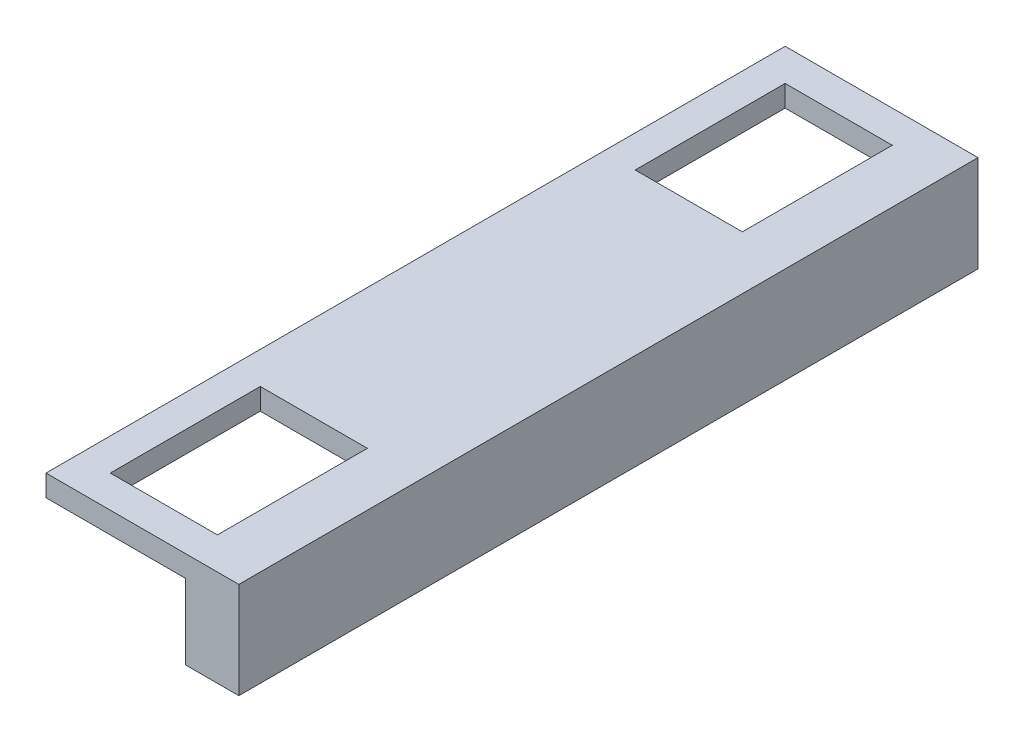
ISO-10303-21;
HEADER;
FILE_DESCRIPTION(('STEP AP214'),'2;1');
FILE_NAME('part.step','',(''),(''),'','','');
FILE_SCHEMA(('AUTOMOTIVE_DESIGN { 1 0 10303 214 1 1 1 1 }'));
ENDSEC;
DATA;
#1=APPLICATION_CONTEXT('core data for automotive mechanical design processes');
#2=APPLICATION_PROTOCOL_DEFINITION('international standard','automotive_design',2000,#1);
#3=PRODUCT_CONTEXT('',#1,'mechanical');
#4=PRODUCT('Part','Part','',(#3));
#5=PRODUCT_RELATED_PRODUCT_CATEGORY('part','',(#4));
#6=PRODUCT_DEFINITION_FORMATION('','',#4);
#7=PRODUCT_DEFINITION_CONTEXT('part definition',#1,'design');
#8=PRODUCT_DEFINITION('design','',#6,#7);
#9=PRODUCT_DEFINITION_SHAPE('','',#8);
#10=(LENGTH_UNIT() NAMED_UNIT(*) SI_UNIT(.MILLI.,.METRE.));
#11=(NAMED_UNIT(*) PLANE_ANGLE_UNIT() SI_UNIT($,.RADIAN.));
#12=(NAMED_UNIT(*) SI_UNIT($,.STERADIAN.) SOLID_ANGLE_UNIT());
#13=UNCERTAINTY_MEASURE_WITH_UNIT(LENGTH_MEASURE(1.E-05),#10,'distance_accuracy_value','');
#14=(GEOMETRIC_REPRESENTATION_CONTEXT(3) GLOBAL_UNCERTAINTY_ASSIGNED_CONTEXT((#13)) GLOBAL_UNIT_ASSIGNED_CONTEXT((#10,
#11,#12)) REPRESENTATION_CONTEXT('',''));
#15=CARTESIAN_POINT('',(0.,0.,0.));
#16=DIRECTION('',(0.,0.,1.));
#17=DIRECTION('',(1.,0.,0.));
#18=AXIS2_PLACEMENT_3D('',#15,#16,#17);
#19=CARTESIAN_POINT('',(2.5,8.,-69.));
#20=DIRECTION('',(0.,-1.,0.));
#21=DIRECTION('',(0.,0.,-1.));
#22=AXIS2_PLACEMENT_3D('',#19,#20,#21);
#23=PLANE('',#22);
#24=DIRECTION('',(0.,0.,1.));
#25=VECTOR('',#24,1.);
#26=CARTESIAN_POINT('',(-7.5,8.,-69.));
#27=LINE('',#26,#25);
#28=CARTESIAN_POINT('',(-7.5,8.,-66.));
#29=VERTEX_POINT('',#28);
#30=CARTESIAN_POINT('',(-7.50000000000001,8.,-52.));
#31=VERTEX_POINT('',#30);
#32=EDGE_CURVE('E277',#29,#31,#27,.T.);
#33=ORIENTED_EDGE('',*,*,#32,.T.);
#34=DIRECTION('',(1.,0.,0.));
#35=VECTOR('',#34,1.);
#36=CARTESIAN_POINT('',(2.5,8.,-52.));
#37=LINE('',#36,#35);
#38=CARTESIAN_POINT('',(2.49999999999999,8.,-52.));
#39=VERTEX_POINT('',#38);
#40=EDGE_CURVE('E281',#31,#39,#37,.T.);
#41=ORIENTED_EDGE('',*,*,#40,.T.);
#42=DIRECTION('',(0.,0.,1.));
#43=VECTOR('',#42,1.);
#44=CARTESIAN_POINT('',(2.5,8.,-69.));
#45=LINE('',#44,#43);
#46=CARTESIAN_POINT('',(2.5,8.,-37.));
#47=VERTEX_POINT('',#46);
#48=EDGE_CURVE('E430',#39,#47,#45,.T.);
#49=ORIENTED_EDGE('',*,*,#48,.T.);
#50=DIRECTION('',(1.,0.,0.));
#51=VECTOR('',#50,1.);
#52=CARTESIAN_POINT('',(-10.5,8.,-37.));
#53=LINE('',#52,#51);
#54=CARTESIAN_POINT('',(-10.5,8.,-37.));
#55=VERTEX_POINT('',#54);
#56=EDGE_CURVE('E359',#55,#47,#53,.T.);
#57=ORIENTED_EDGE('',*,*,#56,.F.);
#58=DIRECTION('',(0.,0.,1.));
#59=VECTOR('',#58,1.);
#60=CARTESIAN_POINT('',(-10.5,8.,-69.));
#61=LINE('',#60,#59);
#62=CARTESIAN_POINT('',(-10.5,8.,-69.));
#63=VERTEX_POINT('',#62);
#64=EDGE_CURVE('E368',#63,#55,#61,.T.);
#65=ORIENTED_EDGE('',*,*,#64,.F.);
#66=DIRECTION('',(1.,0.,0.));
#67=VECTOR('',#66,1.);
#68=CARTESIAN_POINT('',(2.5,8.,-69.));
#69=LINE('',#68,#67);
#70=CARTESIAN_POINT('',(2.5,8.,-69.));
#71=VERTEX_POINT('',#70);
#72=EDGE_CURVE('E397',#63,#71,#69,.T.);
#73=ORIENTED_EDGE('',*,*,#72,.T.);
#74=CARTESIAN_POINT('',(2.5,8.,-66.));
#75=VERTEX_POINT('',#74);
#76=EDGE_CURVE('E426',#71,#75,#45,.T.);
#77=ORIENTED_EDGE('',*,*,#76,.T.);
#78=DIRECTION('',(-1.,0.,0.));
#79=VECTOR('',#78,1.);
#80=CARTESIAN_POINT('',(2.5,8.,-66.));
#81=LINE('',#80,#79);
#82=EDGE_CURVE('E265',#75,#29,#81,.T.);
#83=ORIENTED_EDGE('',*,*,#82,.T.);
#84=EDGE_LOOP('',(#33,#41,#49,#57,#65,#73,#77,#83));
#85=FACE_BOUND('',#84,.T.);
#86=ADVANCED_FACE('F45',(#85),#23,.T.);
#87=CARTESIAN_POINT('',(-7.5,10.,-69.));
#88=DIRECTION('',(0.,1.,0.));
#89=DIRECTION('',(0.,0.,1.));
#90=AXIS2_PLACEMENT_3D('',#87,#88,#89);
#91=PLANE('',#90);
#92=DIRECTION('',(0.,0.,-1.));
#93=VECTOR('',#92,1.);
#94=CARTESIAN_POINT('',(2.49999999999999,10.,-17.));
#95=LINE('',#94,#93);
#96=CARTESIAN_POINT('',(2.5,10.,-3.));
#97=VERTEX_POINT('',#96);
#98=CARTESIAN_POINT('',(2.5,10.,-17.));
#99=VERTEX_POINT('',#98);
#100=EDGE_CURVE('E290',#97,#99,#95,.T.);
#101=ORIENTED_EDGE('',*,*,#100,.F.);
#102=DIRECTION('',(1.,0.,0.));
#103=VECTOR('',#102,1.);
#104=CARTESIAN_POINT('',(-7.5,10.,-3.));
#105=LINE('',#104,#103);
#106=CARTESIAN_POINT('',(-7.5,10.,-3.));
#107=VERTEX_POINT('',#106);
#108=EDGE_CURVE('E304',#107,#97,#105,.T.);
#109=ORIENTED_EDGE('',*,*,#108,.F.);
#110=DIRECTION('',(0.,0.,1.));
#111=VECTOR('',#110,1.);
#112=CARTESIAN_POINT('',(-7.5,10.,-3.));
#113=LINE('',#112,#111);
#114=CARTESIAN_POINT('',(-7.50000000000001,10.,-17.));
#115=VERTEX_POINT('',#114);
#116=EDGE_CURVE('E300',#115,#107,#113,.T.);
#117=ORIENTED_EDGE('',*,*,#116,.F.);
#118=DIRECTION('',(-1.,0.,0.));
#119=VECTOR('',#118,1.);
#120=CARTESIAN_POINT('',(-7.50000000000001,10.,-17.));
#121=LINE('',#120,#119);
#122=EDGE_CURVE('E296',#99,#115,#121,.T.);
#123=ORIENTED_EDGE('',*,*,#122,.F.);
#124=EDGE_LOOP('',(#101,#109,#117,#123));
#125=FACE_BOUND('',#124,.T.);
#126=DIRECTION('',(-1.,0.,0.));
#127=VECTOR('',#126,1.);
#128=CARTESIAN_POINT('',(-7.5,10.,0.));
#129=LINE('',#128,#127);
#130=CARTESIAN_POINT('',(7.5,10.,0.));
#131=VERTEX_POINT('',#130);
#132=CARTESIAN_POINT('',(-10.5,10.,0.));
#133=VERTEX_POINT('',#132);
#134=EDGE_CURVE('E413',#131,#133,#129,.T.);
#135=ORIENTED_EDGE('',*,*,#134,.F.);
#136=DIRECTION('',(0.,0.,1.));
#137=VECTOR('',#136,1.);
#138=CARTESIAN_POINT('',(7.5,10.,-69.));
#139=LINE('',#138,#137);
#140=CARTESIAN_POINT('',(7.5,10.,-69.));
#141=VERTEX_POINT('',#140);
#142=EDGE_CURVE('E432',#141,#131,#139,.T.);
#143=ORIENTED_EDGE('',*,*,#142,.F.);
#144=DIRECTION('',(-1.,0.,0.));
#145=VECTOR('',#144,1.);
#146=CARTESIAN_POINT('',(-7.5,10.,-69.));
#147=LINE('',#146,#145);
#148=CARTESIAN_POINT('',(-10.5,10.,-69.));
#149=VERTEX_POINT('',#148);
#150=EDGE_CURVE('E394',#141,#149,#147,.T.);
#151=ORIENTED_EDGE('',*,*,#150,.T.);
#152=DIRECTION('',(0.,0.,-1.));
#153=VECTOR('',#152,1.);
#154=CARTESIAN_POINT('',(-10.5,10.,0.));
#155=LINE('',#154,#153);
#156=EDGE_CURVE('E376',#133,#149,#155,.T.);
#157=ORIENTED_EDGE('',*,*,#156,.F.);
#158=EDGE_LOOP('',(#135,#143,#151,#157));
#159=FACE_BOUND('',#158,.T.);
#160=DIRECTION('',(1.,0.,0.));
#161=VECTOR('',#160,1.);
#162=CARTESIAN_POINT('',(-7.5,10.,-66.));
#163=LINE('',#162,#161);
#164=CARTESIAN_POINT('',(-7.5,10.,-66.));
#165=VERTEX_POINT('',#164);
#166=CARTESIAN_POINT('',(2.5,10.,-66.));
#167=VERTEX_POINT('',#166);
#168=EDGE_CURVE('E249',#165,#167,#163,.T.);
#169=ORIENTED_EDGE('',*,*,#168,.T.);
#170=DIRECTION('',(0.,0.,1.));
#171=VECTOR('',#170,1.);
#172=CARTESIAN_POINT('',(2.49999999999999,10.,-52.));
#173=LINE('',#172,#171);
#174=CARTESIAN_POINT('',(2.49999999999999,10.,-52.));
#175=VERTEX_POINT('',#174);
#176=EDGE_CURVE('E240',#167,#175,#173,.T.);
#177=ORIENTED_EDGE('',*,*,#176,.T.);
#178=DIRECTION('',(-1.,0.,0.));
#179=VECTOR('',#178,1.);
#180=CARTESIAN_POINT('',(-7.50000000000001,10.,-52.));
#181=LINE('',#180,#179);
#182=CARTESIAN_POINT('',(-7.50000000000001,10.,-52.));
#183=VERTEX_POINT('',#182);
#184=EDGE_CURVE('E257',#175,#183,#181,.T.);
#185=ORIENTED_EDGE('',*,*,#184,.T.);
#186=DIRECTION('',(0.,0.,-1.));
#187=VECTOR('',#186,1.);
#188=CARTESIAN_POINT('',(-7.5,10.,-66.));
#189=LINE('',#188,#187);
#190=EDGE_CURVE('E253',#183,#165,#189,.T.);
#191=ORIENTED_EDGE('',*,*,#190,.T.);
#192=EDGE_LOOP('',(#169,#177,#185,#191));
#193=FACE_BOUND('',#192,.T.);
#194=ADVANCED_FACE('F477',(#125,#159,#193),#91,.T.);
#195=CARTESIAN_POINT('',(2.5,0.999999999999998,-69.));
#196=DIRECTION('',(-1.,0.,0.));
#197=DIRECTION('',(0.,0.,1.));
#198=AXIS2_PLACEMENT_3D('',#195,#196,#197);
#199=PLANE('',#198);
#200=DIRECTION('',(0.,0.,1.));
#201=VECTOR('',#200,1.);
#202=CARTESIAN_POINT('',(2.5,0.999999999999998,-69.));
#203=LINE('',#202,#201);
#204=CARTESIAN_POINT('',(2.5,0.999999999999999,-32.));
#205=VERTEX_POINT('',#204);
#206=CARTESIAN_POINT('',(2.5,0.999999999999998,0.));
#207=VERTEX_POINT('',#206);
#208=EDGE_CURVE('E425',#205,#207,#203,.T.);
#209=ORIENTED_EDGE('',*,*,#208,.T.);
#210=DIRECTION('',(0.,-1.,0.));
#211=VECTOR('',#210,1.);
#212=CARTESIAN_POINT('',(2.5,0.999999999999998,0.));
#213=LINE('',#212,#211);
#214=CARTESIAN_POINT('',(2.5,8.,0.));
#215=VERTEX_POINT('',#214);
#216=EDGE_CURVE('E390',#215,#207,#213,.T.);
#217=ORIENTED_EDGE('',*,*,#216,.F.);
#218=CARTESIAN_POINT('',(2.5,8.,-3.));
#219=VERTEX_POINT('',#218);
#220=EDGE_CURVE('E434',#219,#215,#45,.T.);
#221=ORIENTED_EDGE('',*,*,#220,.F.);
#222=DIRECTION('',(0.,1.,0.));
#223=VECTOR('',#222,1.);
#224=CARTESIAN_POINT('',(2.5,0.999999999999999,-3.));
#225=LINE('',#224,#223);
#226=EDGE_CURVE('E309',#219,#97,#225,.T.);
#227=ORIENTED_EDGE('',*,*,#226,.T.);
#228=ORIENTED_EDGE('',*,*,#100,.T.);
#229=DIRECTION('',(0.,1.,0.));
#230=VECTOR('',#229,1.);
#231=CARTESIAN_POINT('',(2.49999999999999,0.999999999999999,-17.));
#232=LINE('',#231,#230);
#233=CARTESIAN_POINT('',(2.49999999999999,8.,-17.));
#234=VERTEX_POINT('',#233);
#235=EDGE_CURVE('E308',#234,#99,#232,.T.);
#236=ORIENTED_EDGE('',*,*,#235,.F.);
#237=CARTESIAN_POINT('',(2.5,8.,-32.));
#238=VERTEX_POINT('',#237);
#239=EDGE_CURVE('E431',#238,#234,#45,.T.);
#240=ORIENTED_EDGE('',*,*,#239,.F.);
#241=DIRECTION('',(0.,1.,0.));
#242=VECTOR('',#241,1.);
#243=CARTESIAN_POINT('',(2.5,8.,-32.));
#244=LINE('',#243,#242);
#245=EDGE_CURVE('E335',#205,#238,#244,.T.);
#246=ORIENTED_EDGE('',*,*,#245,.F.);
#247=EDGE_LOOP('',(#209,#217,#221,#227,#228,#236,#240,#246));
#248=FACE_BOUND('',#247,.T.);
#249=ADVANCED_FACE('F452',(#248),#199,.T.);
#250=CARTESIAN_POINT('',(2.5,0.999999999999998,-69.));
#251=VERTEX_POINT('',#250);
#252=CARTESIAN_POINT('',(2.5,0.999999999999998,-37.));
#253=VERTEX_POINT('',#252);
#254=EDGE_CURVE('E54',#251,#253,#203,.T.);
#255=ORIENTED_EDGE('',*,*,#254,.T.);
#256=DIRECTION('',(0.,-1.,0.));
#257=VECTOR('',#256,1.);
#258=CARTESIAN_POINT('',(2.5,0.999999999999998,-37.));
#259=LINE('',#258,#257);
#260=EDGE_CURVE('E341',#47,#253,#259,.T.);
#261=ORIENTED_EDGE('',*,*,#260,.F.);
#262=ORIENTED_EDGE('',*,*,#48,.F.);
#263=DIRECTION('',(0.,1.,0.));
#264=VECTOR('',#263,1.);
#265=CARTESIAN_POINT('',(2.49999999999999,0.999999999999999,-52.));
#266=LINE('',#265,#264);
#267=EDGE_CURVE('E262',#39,#175,#266,.T.);
#268=ORIENTED_EDGE('',*,*,#267,.T.);
#269=ORIENTED_EDGE('',*,*,#176,.F.);
#270=DIRECTION('',(0.,1.,0.));
#271=VECTOR('',#270,1.);
#272=CARTESIAN_POINT('',(2.5,0.999999999999999,-66.));
#273=LINE('',#272,#271);
#274=EDGE_CURVE('E261',#75,#167,#273,.T.);
#275=ORIENTED_EDGE('',*,*,#274,.F.);
#276=ORIENTED_EDGE('',*,*,#76,.F.);
#277=DIRECTION('',(0.,-1.,0.));
#278=VECTOR('',#277,1.);
#279=CARTESIAN_POINT('',(2.5,0.999999999999998,-69.));
#280=LINE('',#279,#278);
#281=EDGE_CURVE('E401',#71,#251,#280,.T.);
#282=ORIENTED_EDGE('',*,*,#281,.T.);
#283=EDGE_LOOP('',(#255,#261,#262,#268,#269,#275,#276,#282));
#284=FACE_BOUND('',#283,.T.);
#285=ADVANCED_FACE('F495',(#284),#199,.T.);
#286=DIRECTION('',(-1.,0.,0.));
#287=VECTOR('',#286,1.);
#288=CARTESIAN_POINT('',(2.50000000000001,8.,-3.));
#289=LINE('',#288,#287);
#290=CARTESIAN_POINT('',(-7.5,8.,-3.));
#291=VERTEX_POINT('',#290);
#292=EDGE_CURVE('E328',#219,#291,#289,.T.);
#293=ORIENTED_EDGE('',*,*,#292,.F.);
#294=ORIENTED_EDGE('',*,*,#220,.T.);
#295=DIRECTION('',(1.,0.,0.));
#296=VECTOR('',#295,1.);
#297=CARTESIAN_POINT('',(2.5,8.,0.));
#298=LINE('',#297,#296);
#299=CARTESIAN_POINT('',(-10.5,8.,0.));
#300=VERTEX_POINT('',#299);
#301=EDGE_CURVE('E416',#300,#215,#298,.T.);
#302=ORIENTED_EDGE('',*,*,#301,.F.);
#303=CARTESIAN_POINT('',(-10.5,8.,-32.));
#304=VERTEX_POINT('',#303);
#305=EDGE_CURVE('E367',#304,#300,#61,.T.);
#306=ORIENTED_EDGE('',*,*,#305,.F.);
#307=DIRECTION('',(1.,0.,0.));
#308=VECTOR('',#307,1.);
#309=CARTESIAN_POINT('',(-10.5,8.,-32.));
#310=LINE('',#309,#308);
#311=EDGE_CURVE('E363',#304,#238,#310,.T.);
#312=ORIENTED_EDGE('',*,*,#311,.T.);
#313=ORIENTED_EDGE('',*,*,#239,.T.);
#314=DIRECTION('',(1.,0.,0.));
#315=VECTOR('',#314,1.);
#316=CARTESIAN_POINT('',(2.50000000000002,8.,-17.));
#317=LINE('',#316,#315);
#318=CARTESIAN_POINT('',(-7.50000000000001,8.,-17.));
#319=VERTEX_POINT('',#318);
#320=EDGE_CURVE('E312',#319,#234,#317,.T.);
#321=ORIENTED_EDGE('',*,*,#320,.F.);
#322=DIRECTION('',(0.,0.,-1.));
#323=VECTOR('',#322,1.);
#324=CARTESIAN_POINT('',(-7.50000000000001,8.,-69.));
#325=LINE('',#324,#323);
#326=EDGE_CURVE('E324',#291,#319,#325,.T.);
#327=ORIENTED_EDGE('',*,*,#326,.F.);
#328=EDGE_LOOP('',(#293,#294,#302,#306,#312,#313,#321,#327));
#329=FACE_BOUND('',#328,.T.);
#330=ADVANCED_FACE('F463',(#329),#23,.T.);
#331=CARTESIAN_POINT('',(7.5,0.999999999999998,-69.));
#332=DIRECTION('',(0.,-1.,0.));
#333=DIRECTION('',(0.,0.,-1.));
#334=AXIS2_PLACEMENT_3D('',#331,#332,#333);
#335=PLANE('',#334);
#336=CARTESIAN_POINT('',(4.99999999999999,0.999999999999998,-24.5));
#337=DIRECTION('',(0.,-1.,0.));
#338=DIRECTION('',(0.,0.,-1.));
#339=AXIS2_PLACEMENT_3D('',#336,#337,#338);
#340=CIRCLE('',#339,1.6);
#341=CARTESIAN_POINT('',(6.6,0.999999999999998,-24.5));
#342=VERTEX_POINT('',#341);
#343=CARTESIAN_POINT('',(3.4,0.999999999999998,-24.5));
#344=VERTEX_POINT('',#343);
#345=EDGE_CURVE('E61',#342,#344,#340,.T.);
#346=ORIENTED_EDGE('',*,*,#345,.F.);
#347=DIRECTION('',(0.,0.,1.));
#348=VECTOR('',#347,1.);
#349=CARTESIAN_POINT('',(6.6,0.999999999999998,-24.5));
#350=LINE('',#349,#348);
#351=CARTESIAN_POINT('',(6.6,0.999999999999998,-44.5));
#352=VERTEX_POINT('',#351);
#353=EDGE_CURVE('E218',#352,#342,#350,.T.);
#354=ORIENTED_EDGE('',*,*,#353,.F.);
#355=CARTESIAN_POINT('',(5.,0.999999999999998,-44.5));
#356=DIRECTION('',(0.,-1.,0.));
#357=DIRECTION('',(0.,0.,-1.));
#358=AXIS2_PLACEMENT_3D('',#355,#356,#357);
#359=CIRCLE('',#358,1.6);
#360=CARTESIAN_POINT('',(3.4,0.999999999999998,-44.5));
#361=VERTEX_POINT('',#360);
#362=EDGE_CURVE('E222',#361,#352,#359,.T.);
#363=ORIENTED_EDGE('',*,*,#362,.F.);
#364=DIRECTION('',(0.,0.,-1.));
#365=VECTOR('',#364,1.);
#366=CARTESIAN_POINT('',(3.4,0.999999999999998,-24.5));
#367=LINE('',#366,#365);
#368=EDGE_CURVE('E231',#344,#361,#367,.T.);
#369=ORIENTED_EDGE('',*,*,#368,.F.);
#370=EDGE_LOOP('',(#346,#354,#363,#369));
#371=FACE_BOUND('',#370,.T.);
#372=DIRECTION('',(1.,0.,0.));
#373=VECTOR('',#372,1.);
#374=CARTESIAN_POINT('',(7.5,0.999999999999998,0.));
#375=LINE('',#374,#373);
#376=CARTESIAN_POINT('',(7.5,0.999999999999998,0.));
#377=VERTEX_POINT('',#376);
#378=EDGE_CURVE('E384',#207,#377,#375,.T.);
#379=ORIENTED_EDGE('',*,*,#378,.F.);
#380=ORIENTED_EDGE('',*,*,#208,.F.);
#381=DIRECTION('',(1.,0.,0.));
#382=VECTOR('',#381,1.);
#383=CARTESIAN_POINT('',(-10.5,0.999999999999999,-32.));
#384=LINE('',#383,#382);
#385=CARTESIAN_POINT('',(-10.5,0.999999999999999,-32.));
#386=VERTEX_POINT('',#385);
#387=EDGE_CURVE('E347',#386,#205,#384,.T.);
#388=ORIENTED_EDGE('',*,*,#387,.F.);
#389=DIRECTION('',(0.,0.,1.));
#390=VECTOR('',#389,1.);
#391=CARTESIAN_POINT('',(-10.5,0.999999999999998,-37.));
#392=LINE('',#391,#390);
#393=CARTESIAN_POINT('',(-10.5,0.999999999999998,-37.));
#394=VERTEX_POINT('',#393);
#395=EDGE_CURVE('E344',#394,#386,#392,.T.);
#396=ORIENTED_EDGE('',*,*,#395,.F.);
#397=DIRECTION('',(1.,0.,0.));
#398=VECTOR('',#397,1.);
#399=CARTESIAN_POINT('',(-10.5,0.999999999999998,-37.));
#400=LINE('',#399,#398);
#401=EDGE_CURVE('E355',#394,#253,#400,.T.);
#402=ORIENTED_EDGE('',*,*,#401,.T.);
#403=ORIENTED_EDGE('',*,*,#254,.F.);
#404=DIRECTION('',(1.,0.,0.));
#405=VECTOR('',#404,1.);
#406=CARTESIAN_POINT('',(7.5,0.999999999999998,-69.));
#407=LINE('',#406,#405);
#408=CARTESIAN_POINT('',(7.5,0.999999999999998,-69.));
#409=VERTEX_POINT('',#408);
#410=EDGE_CURVE('E385',#251,#409,#407,.T.);
#411=ORIENTED_EDGE('',*,*,#410,.T.);
#412=DIRECTION('',(0.,0.,1.));
#413=VECTOR('',#412,1.);
#414=CARTESIAN_POINT('',(7.5,0.999999999999998,-69.));
#415=LINE('',#414,#413);
#416=EDGE_CURVE('E405',#409,#377,#415,.T.);
#417=ORIENTED_EDGE('',*,*,#416,.T.);
#418=EDGE_LOOP('',(#379,#380,#388,#396,#402,#403,#411,#417));
#419=FACE_BOUND('',#418,.T.);
#420=ADVANCED_FACE('F47',(#371,#419),#335,.T.);
#421=CARTESIAN_POINT('',(7.5,10.,-69.));
#422=DIRECTION('',(1.,0.,0.));
#423=DIRECTION('',(0.,0.,-1.));
#424=AXIS2_PLACEMENT_3D('',#421,#422,#423);
#425=PLANE('',#424);
#426=DIRECTION('',(0.,1.,0.));
#427=VECTOR('',#426,1.);
#428=CARTESIAN_POINT('',(7.5,10.,0.));
#429=LINE('',#428,#427);
#430=EDGE_CURVE('E409',#377,#131,#429,.T.);
#431=ORIENTED_EDGE('',*,*,#430,.F.);
#432=ORIENTED_EDGE('',*,*,#416,.F.);
#433=DIRECTION('',(0.,1.,0.));
#434=VECTOR('',#433,1.);
#435=CARTESIAN_POINT('',(7.5,10.,-69.));
#436=LINE('',#435,#434);
#437=EDGE_CURVE('E389',#409,#141,#436,.T.);
#438=ORIENTED_EDGE('',*,*,#437,.T.);
#439=ORIENTED_EDGE('',*,*,#142,.T.);
#440=EDGE_LOOP('',(#431,#432,#438,#439));
#441=FACE_BOUND('',#440,.T.);
#442=ADVANCED_FACE('F443',(#441),#425,.T.);
#443=CARTESIAN_POINT('',(0.,0.,-69.));
#444=DIRECTION('',(0.,0.,-1.));
#445=DIRECTION('',(-1.,0.,0.));
#446=AXIS2_PLACEMENT_3D('',#443,#444,#445);
#447=PLANE('',#446);
#448=ORIENTED_EDGE('',*,*,#410,.F.);
#449=ORIENTED_EDGE('',*,*,#281,.F.);
#450=ORIENTED_EDGE('',*,*,#72,.F.);
#451=DIRECTION('',(0.,-1.,0.));
#452=VECTOR('',#451,1.);
#453=CARTESIAN_POINT('',(-10.5,10.,-69.));
#454=LINE('',#453,#452);
#455=EDGE_CURVE('E380',#149,#63,#454,.T.);
#456=ORIENTED_EDGE('',*,*,#455,.F.);
#457=ORIENTED_EDGE('',*,*,#150,.F.);
#458=ORIENTED_EDGE('',*,*,#437,.F.);
#459=EDGE_LOOP('',(#448,#449,#450,#456,#457,#458));
#460=FACE_BOUND('',#459,.T.);
#461=ADVANCED_FACE('F499',(#460),#447,.T.);
#462=CARTESIAN_POINT('',(0.,0.,0.));
#463=DIRECTION('',(0.,0.,-1.));
#464=DIRECTION('',(-1.,0.,0.));
#465=AXIS2_PLACEMENT_3D('',#462,#463,#464);
#466=PLANE('',#465);
#467=ORIENTED_EDGE('',*,*,#378,.T.);
#468=ORIENTED_EDGE('',*,*,#430,.T.);
#469=ORIENTED_EDGE('',*,*,#134,.T.);
#470=DIRECTION('',(0.,1.,0.));
#471=VECTOR('',#470,1.);
#472=CARTESIAN_POINT('',(-10.5,8.,0.));
#473=LINE('',#472,#471);
#474=EDGE_CURVE('E372',#300,#133,#473,.T.);
#475=ORIENTED_EDGE('',*,*,#474,.F.);
#476=ORIENTED_EDGE('',*,*,#301,.T.);
#477=ORIENTED_EDGE('',*,*,#216,.T.);
#478=EDGE_LOOP('',(#467,#468,#469,#475,#476,#477));
#479=FACE_BOUND('',#478,.T.);
#480=ADVANCED_FACE('F446',(#479),#466,.F.);
#481=CARTESIAN_POINT('',(-10.5,0.,0.));
#482=DIRECTION('',(-1.,0.,0.));
#483=DIRECTION('',(0.,0.,1.));
#484=AXIS2_PLACEMENT_3D('',#481,#482,#483);
#485=PLANE('',#484);
#486=ORIENTED_EDGE('',*,*,#64,.T.);
#487=DIRECTION('',(0.,-1.,0.));
#488=VECTOR('',#487,1.);
#489=CARTESIAN_POINT('',(-10.5,0.999999999999998,-37.));
#490=LINE('',#489,#488);
#491=EDGE_CURVE('E340',#55,#394,#490,.T.);
#492=ORIENTED_EDGE('',*,*,#491,.T.);
#493=ORIENTED_EDGE('',*,*,#395,.T.);
#494=DIRECTION('',(0.,1.,0.));
#495=VECTOR('',#494,1.);
#496=CARTESIAN_POINT('',(-10.5,8.,-32.));
#497=LINE('',#496,#495);
#498=EDGE_CURVE('E336',#386,#304,#497,.T.);
#499=ORIENTED_EDGE('',*,*,#498,.T.);
#500=ORIENTED_EDGE('',*,*,#305,.T.);
#501=ORIENTED_EDGE('',*,*,#474,.T.);
#502=ORIENTED_EDGE('',*,*,#156,.T.);
#503=ORIENTED_EDGE('',*,*,#455,.T.);
#504=EDGE_LOOP('',(#486,#492,#493,#499,#500,#501,#502,#503));
#505=FACE_BOUND('',#504,.T.);
#506=ADVANCED_FACE('F486',(#505),#485,.T.);
#507=CARTESIAN_POINT('',(-10.5,8.,-32.));
#508=DIRECTION('',(0.,0.,-1.));
#509=DIRECTION('',(-1.,0.,0.));
#510=AXIS2_PLACEMENT_3D('',#507,#508,#509);
#511=PLANE('',#510);
#512=CARTESIAN_POINT('',(-2.5,4.5,-32.));
#513=DIRECTION('',(0.,0.,-1.));
#514=DIRECTION('',(-1.,0.,0.));
#515=AXIS2_PLACEMENT_3D('',#512,#513,#514);
#516=CIRCLE('',#515,1.5);
#517=CARTESIAN_POINT('',(-4.,4.5,-32.));
#518=VERTEX_POINT('',#517);
#519=EDGE_CURVE('E11',#518,#518,#516,.F.);
#520=ORIENTED_EDGE('',*,*,#519,.F.);
#521=EDGE_LOOP('',(#520));
#522=FACE_BOUND('',#521,.T.);
#523=ORIENTED_EDGE('',*,*,#245,.T.);
#524=ORIENTED_EDGE('',*,*,#311,.F.);
#525=ORIENTED_EDGE('',*,*,#498,.F.);
#526=ORIENTED_EDGE('',*,*,#387,.T.);
#527=EDGE_LOOP('',(#523,#524,#525,#526));
#528=FACE_BOUND('',#527,.T.);
#529=ADVANCED_FACE('F484',(#522,#528),#511,.F.);
#530=CARTESIAN_POINT('',(-10.5,0.999999999999998,-37.));
#531=DIRECTION('',(0.,0.,1.));
#532=DIRECTION('',(1.,0.,0.));
#533=AXIS2_PLACEMENT_3D('',#530,#531,#532);
#534=PLANE('',#533);
#535=CARTESIAN_POINT('',(-2.5,4.5,-37.));
#536=DIRECTION('',(0.,0.,1.));
#537=DIRECTION('',(1.,0.,0.));
#538=AXIS2_PLACEMENT_3D('',#535,#536,#537);
#539=CIRCLE('',#538,1.5);
#540=CARTESIAN_POINT('',(-0.999999999999999,4.5,-37.));
#541=VERTEX_POINT('',#540);
#542=EDGE_CURVE('E285',#541,#541,#539,.T.);
#543=ORIENTED_EDGE('',*,*,#542,.T.);
#544=EDGE_LOOP('',(#543));
#545=FACE_BOUND('',#544,.T.);
#546=ORIENTED_EDGE('',*,*,#260,.T.);
#547=ORIENTED_EDGE('',*,*,#401,.F.);
#548=ORIENTED_EDGE('',*,*,#491,.F.);
#549=ORIENTED_EDGE('',*,*,#56,.T.);
#550=EDGE_LOOP('',(#546,#547,#548,#549));
#551=FACE_BOUND('',#550,.T.);
#552=ADVANCED_FACE('F490',(#545,#551),#534,.F.);
#553=CARTESIAN_POINT('',(-2.5,4.5,-29.));
#554=DIRECTION('',(0.,0.,-1.));
#555=DIRECTION('',(-1.,0.,0.));
#556=AXIS2_PLACEMENT_3D('',#553,#554,#555);
#557=CYLINDRICAL_SURFACE('',#556,1.5);
#558=CARTESIAN_POINT('',(-2.5,4.5,-29.));
#559=DIRECTION('',(0.,0.,1.));
#560=DIRECTION('',(1.,0.,0.));
#561=AXIS2_PLACEMENT_3D('',#558,#559,#560);
#562=CIRCLE('',#561,1.5);
#563=CARTESIAN_POINT('',(-0.999999999999999,4.5,-29.));
#564=VERTEX_POINT('',#563);
#565=EDGE_CURVE('E331',#564,#564,#562,.T.);
#566=ORIENTED_EDGE('',*,*,#565,.F.);
#567=EDGE_LOOP('',(#566));
#568=FACE_BOUND('',#567,.T.);
#569=ORIENTED_EDGE('',*,*,#519,.T.);
#570=EDGE_LOOP('',(#569));
#571=FACE_BOUND('',#570,.T.);
#572=ADVANCED_FACE('F554',(#568,#571),#557,.T.);
#573=CARTESIAN_POINT('',(-2.5,4.5,-29.));
#574=DIRECTION('',(0.,0.,1.));
#575=DIRECTION('',(1.,0.,0.));
#576=AXIS2_PLACEMENT_3D('',#573,#574,#575);
#577=PLANE('',#576);
#578=ORIENTED_EDGE('',*,*,#565,.T.);
#579=EDGE_LOOP('',(#578));
#580=FACE_BOUND('',#579,.T.);
#581=ADVANCED_FACE('F558',(#580),#577,.T.);
#582=CARTESIAN_POINT('',(-7.5,0.999999999999999,-3.));
#583=DIRECTION('',(0.,0.,1.));
#584=DIRECTION('',(1.,0.,0.));
#585=AXIS2_PLACEMENT_3D('',#582,#583,#584);
#586=PLANE('',#585);
#587=ORIENTED_EDGE('',*,*,#292,.T.);
#588=DIRECTION('',(0.,1.,0.));
#589=VECTOR('',#588,1.);
#590=CARTESIAN_POINT('',(-7.5,0.999999999999999,-3.));
#591=LINE('',#590,#589);
#592=EDGE_CURVE('E313',#291,#107,#591,.T.);
#593=ORIENTED_EDGE('',*,*,#592,.T.);
#594=ORIENTED_EDGE('',*,*,#108,.T.);
#595=ORIENTED_EDGE('',*,*,#226,.F.);
#596=EDGE_LOOP('',(#587,#593,#594,#595));
#597=FACE_BOUND('',#596,.T.);
#598=ADVANCED_FACE('F469',(#597),#586,.F.);
#599=CARTESIAN_POINT('',(-7.5,0.999999999999999,-3.));
#600=DIRECTION('',(-1.,0.,0.));
#601=DIRECTION('',(0.,0.,1.));
#602=AXIS2_PLACEMENT_3D('',#599,#600,#601);
#603=PLANE('',#602);
#604=ORIENTED_EDGE('',*,*,#326,.T.);
#605=DIRECTION('',(0.,1.,0.));
#606=VECTOR('',#605,1.);
#607=CARTESIAN_POINT('',(-7.50000000000001,0.999999999999999,-17.));
#608=LINE('',#607,#606);
#609=EDGE_CURVE('E316',#319,#115,#608,.T.);
#610=ORIENTED_EDGE('',*,*,#609,.T.);
#611=ORIENTED_EDGE('',*,*,#116,.T.);
#612=ORIENTED_EDGE('',*,*,#592,.F.);
#613=EDGE_LOOP('',(#604,#610,#611,#612));
#614=FACE_BOUND('',#613,.T.);
#615=ADVANCED_FACE('F471',(#614),#603,.F.);
#616=CARTESIAN_POINT('',(-7.50000000000001,0.999999999999999,-17.));
#617=DIRECTION('',(0.,0.,-1.));
#618=DIRECTION('',(-1.,0.,0.));
#619=AXIS2_PLACEMENT_3D('',#616,#617,#618);
#620=PLANE('',#619);
#621=ORIENTED_EDGE('',*,*,#320,.T.);
#622=ORIENTED_EDGE('',*,*,#235,.T.);
#623=ORIENTED_EDGE('',*,*,#122,.T.);
#624=ORIENTED_EDGE('',*,*,#609,.F.);
#625=EDGE_LOOP('',(#621,#622,#623,#624));
#626=FACE_BOUND('',#625,.T.);
#627=ADVANCED_FACE('F481',(#626),#620,.F.);
#628=CARTESIAN_POINT('',(-2.5,4.5,-40.));
#629=DIRECTION('',(0.,0.,1.));
#630=DIRECTION('',(1.,0.,0.));
#631=AXIS2_PLACEMENT_3D('',#628,#629,#630);
#632=CYLINDRICAL_SURFACE('',#631,1.5);
#633=CARTESIAN_POINT('',(-2.5,4.5,-40.));
#634=DIRECTION('',(0.,0.,1.));
#635=DIRECTION('',(1.,0.,0.));
#636=AXIS2_PLACEMENT_3D('',#633,#634,#635);
#637=CIRCLE('',#636,1.5);
#638=CARTESIAN_POINT('',(-0.999999999999999,4.5,-40.));
#639=VERTEX_POINT('',#638);
#640=EDGE_CURVE('E286',#639,#639,#637,.T.);
#641=ORIENTED_EDGE('',*,*,#640,.T.);
#642=EDGE_LOOP('',(#641));
#643=FACE_BOUND('',#642,.T.);
#644=ORIENTED_EDGE('',*,*,#542,.F.);
#645=EDGE_LOOP('',(#644));
#646=FACE_BOUND('',#645,.T.);
#647=ADVANCED_FACE('F564',(#643,#646),#632,.T.);
#648=CARTESIAN_POINT('',(-2.5,4.5,-40.));
#649=DIRECTION('',(0.,0.,-1.));
#650=DIRECTION('',(1.,0.,0.));
#651=AXIS2_PLACEMENT_3D('',#648,#649,#650);
#652=PLANE('',#651);
#653=ORIENTED_EDGE('',*,*,#640,.F.);
#654=EDGE_LOOP('',(#653));
#655=FACE_BOUND('',#654,.T.);
#656=ADVANCED_FACE('F569',(#655),#652,.T.);
#657=CARTESIAN_POINT('',(-7.50000000000001,0.999999999999999,-52.));
#658=DIRECTION('',(0.,0.,-1.));
#659=DIRECTION('',(-1.,0.,0.));
#660=AXIS2_PLACEMENT_3D('',#657,#658,#659);
#661=PLANE('',#660);
#662=DIRECTION('',(0.,1.,0.));
#663=VECTOR('',#662,1.);
#664=CARTESIAN_POINT('',(-7.50000000000001,0.999999999999999,-52.));
#665=LINE('',#664,#663);
#666=EDGE_CURVE('E266',#31,#183,#665,.T.);
#667=ORIENTED_EDGE('',*,*,#666,.T.);
#668=ORIENTED_EDGE('',*,*,#184,.F.);
#669=ORIENTED_EDGE('',*,*,#267,.F.);
#670=ORIENTED_EDGE('',*,*,#40,.F.);
#671=EDGE_LOOP('',(#667,#668,#669,#670));
#672=FACE_BOUND('',#671,.T.);
#673=ADVANCED_FACE('F508',(#672),#661,.T.);
#674=CARTESIAN_POINT('',(-7.5,0.999999999999999,-66.));
#675=DIRECTION('',(1.,0.,0.));
#676=DIRECTION('',(0.,0.,-1.));
#677=AXIS2_PLACEMENT_3D('',#674,#675,#676);
#678=PLANE('',#677);
#679=DIRECTION('',(0.,1.,0.));
#680=VECTOR('',#679,1.);
#681=CARTESIAN_POINT('',(-7.5,0.999999999999999,-66.));
#682=LINE('',#681,#680);
#683=EDGE_CURVE('E69',#29,#165,#682,.T.);
#684=ORIENTED_EDGE('',*,*,#683,.T.);
#685=ORIENTED_EDGE('',*,*,#190,.F.);
#686=ORIENTED_EDGE('',*,*,#666,.F.);
#687=ORIENTED_EDGE('',*,*,#32,.F.);
#688=EDGE_LOOP('',(#684,#685,#686,#687));
#689=FACE_BOUND('',#688,.T.);
#690=ADVANCED_FACE('F512',(#689),#678,.T.);
#691=CARTESIAN_POINT('',(-7.5,0.999999999999999,-66.));
#692=DIRECTION('',(0.,0.,1.));
#693=DIRECTION('',(1.,0.,0.));
#694=AXIS2_PLACEMENT_3D('',#691,#692,#693);
#695=PLANE('',#694);
#696=ORIENTED_EDGE('',*,*,#274,.T.);
#697=ORIENTED_EDGE('',*,*,#168,.F.);
#698=ORIENTED_EDGE('',*,*,#683,.F.);
#699=ORIENTED_EDGE('',*,*,#82,.F.);
#700=EDGE_LOOP('',(#696,#697,#698,#699));
#701=FACE_BOUND('',#700,.T.);
#702=ADVANCED_FACE('F513',(#701),#695,.T.);
#703=CARTESIAN_POINT('',(4.99999999999999,4.,-24.5));
#704=DIRECTION('',(0.,-1.,0.));
#705=DIRECTION('',(0.,0.,-1.));
#706=AXIS2_PLACEMENT_3D('',#703,#704,#705);
#707=CYLINDRICAL_SURFACE('',#706,1.6);
#708=ORIENTED_EDGE('',*,*,#345,.T.);
#709=DIRECTION('',(0.,-1.,0.));
#710=VECTOR('',#709,1.);
#711=CARTESIAN_POINT('',(3.4,4.,-24.5));
#712=LINE('',#711,#710);
#713=CARTESIAN_POINT('',(3.4,4.,-24.5));
#714=VERTEX_POINT('',#713);
#715=EDGE_CURVE('E193',#714,#344,#712,.T.);
#716=ORIENTED_EDGE('',*,*,#715,.F.);
#717=CARTESIAN_POINT('',(4.99999999999999,4.,-24.5));
#718=DIRECTION('',(0.,-1.,0.));
#719=DIRECTION('',(0.,0.,-1.));
#720=AXIS2_PLACEMENT_3D('',#717,#718,#719);
#721=CIRCLE('',#720,1.6);
#722=CARTESIAN_POINT('',(6.6,4.,-24.5));
#723=VERTEX_POINT('',#722);
#724=EDGE_CURVE('E197',#723,#714,#721,.T.);
#725=ORIENTED_EDGE('',*,*,#724,.F.);
#726=DIRECTION('',(0.,-1.,0.));
#727=VECTOR('',#726,1.);
#728=CARTESIAN_POINT('',(6.6,4.,-24.5));
#729=LINE('',#728,#727);
#730=EDGE_CURVE('E237',#723,#342,#729,.T.);
#731=ORIENTED_EDGE('',*,*,#730,.T.);
#732=EDGE_LOOP('',(#708,#716,#725,#731));
#733=FACE_BOUND('',#732,.T.);
#734=ADVANCED_FACE('F195',(#733),#707,.F.);
#735=CARTESIAN_POINT('',(6.6,4.,-24.5));
#736=DIRECTION('',(1.,0.,0.));
#737=DIRECTION('',(0.,0.,-1.));
#738=AXIS2_PLACEMENT_3D('',#735,#736,#737);
#739=PLANE('',#738);
#740=ORIENTED_EDGE('',*,*,#353,.T.);
#741=ORIENTED_EDGE('',*,*,#730,.F.);
#742=DIRECTION('',(0.,0.,1.));
#743=VECTOR('',#742,1.);
#744=CARTESIAN_POINT('',(6.6,4.,-24.5));
#745=LINE('',#744,#743);
#746=CARTESIAN_POINT('',(6.6,4.,-44.5));
#747=VERTEX_POINT('',#746);
#748=EDGE_CURVE('E204',#747,#723,#745,.T.);
#749=ORIENTED_EDGE('',*,*,#748,.F.);
#750=DIRECTION('',(0.,-1.,0.));
#751=VECTOR('',#750,1.);
#752=CARTESIAN_POINT('',(6.6,4.,-44.5));
#753=LINE('',#752,#751);
#754=EDGE_CURVE('E241',#747,#352,#753,.T.);
#755=ORIENTED_EDGE('',*,*,#754,.T.);
#756=EDGE_LOOP('',(#740,#741,#749,#755));
#757=FACE_BOUND('',#756,.T.);
#758=ADVANCED_FACE('F521',(#757),#739,.F.);
#759=CARTESIAN_POINT('',(5.,4.,-44.5));
#760=DIRECTION('',(0.,-1.,0.));
#761=DIRECTION('',(0.,0.,-1.));
#762=AXIS2_PLACEMENT_3D('',#759,#760,#761);
#763=CYLINDRICAL_SURFACE('',#762,1.6);
#764=ORIENTED_EDGE('',*,*,#362,.T.);
#765=ORIENTED_EDGE('',*,*,#754,.F.);
#766=CARTESIAN_POINT('',(5.,4.,-44.5));
#767=DIRECTION('',(0.,-1.,0.));
#768=DIRECTION('',(0.,0.,-1.));
#769=AXIS2_PLACEMENT_3D('',#766,#767,#768);
#770=CIRCLE('',#769,1.6);
#771=CARTESIAN_POINT('',(3.4,4.,-44.5));
#772=VERTEX_POINT('',#771);
#773=EDGE_CURVE('E213',#772,#747,#770,.T.);
#774=ORIENTED_EDGE('',*,*,#773,.F.);
#775=DIRECTION('',(0.,-1.,0.));
#776=VECTOR('',#775,1.);
#777=CARTESIAN_POINT('',(3.4,4.,-44.5));
#778=LINE('',#777,#776);
#779=EDGE_CURVE('E203',#772,#361,#778,.T.);
#780=ORIENTED_EDGE('',*,*,#779,.T.);
#781=EDGE_LOOP('',(#764,#765,#774,#780));
#782=FACE_BOUND('',#781,.T.);
#783=ADVANCED_FACE('F585',(#782),#763,.F.);
#784=CARTESIAN_POINT('',(3.4,4.,-24.5));
#785=DIRECTION('',(-1.,0.,0.));
#786=DIRECTION('',(0.,0.,1.));
#787=AXIS2_PLACEMENT_3D('',#784,#785,#786);
#788=PLANE('',#787);
#789=ORIENTED_EDGE('',*,*,#368,.T.);
#790=ORIENTED_EDGE('',*,*,#779,.F.);
#791=DIRECTION('',(0.,0.,-1.));
#792=VECTOR('',#791,1.);
#793=CARTESIAN_POINT('',(3.4,4.,-24.5));
#794=LINE('',#793,#792);
#795=EDGE_CURVE('E207',#714,#772,#794,.T.);
#796=ORIENTED_EDGE('',*,*,#795,.F.);
#797=ORIENTED_EDGE('',*,*,#715,.T.);
#798=EDGE_LOOP('',(#789,#790,#796,#797));
#799=FACE_BOUND('',#798,.T.);
#800=ADVANCED_FACE('F208',(#799),#788,.F.);
#801=CARTESIAN_POINT('',(4.99999999999999,4.,-24.5));
#802=DIRECTION('',(0.,-1.,0.));
#803=DIRECTION('',(0.,0.,-1.));
#804=AXIS2_PLACEMENT_3D('',#801,#802,#803);
#805=PLANE('',#804);
#806=ORIENTED_EDGE('',*,*,#724,.T.);
#807=ORIENTED_EDGE('',*,*,#795,.T.);
#808=ORIENTED_EDGE('',*,*,#773,.T.);
#809=ORIENTED_EDGE('',*,*,#748,.T.);
#810=EDGE_LOOP('',(#806,#807,#808,#809));
#811=FACE_BOUND('',#810,.T.);
#812=ADVANCED_FACE('F215',(#811),#805,.T.);
#813=CLOSED_SHELL('',(#86,#194,#249,#285,#330,#420,#442,#461,#480,#506,#529,#552,#572,#581,#598,
#615,#627,#647,#656,#673,#690,#702,#734,#758,#783,#800,#812));
#814=MANIFOLD_SOLID_BREP('B2',#813);
#815=ADVANCED_BREP_SHAPE_REPRESENTATION('',(#18,#814),#14);
#816=SHAPE_DEFINITION_REPRESENTATION(#9,#815);
ENDSEC;
END-ISO-10303-21;
